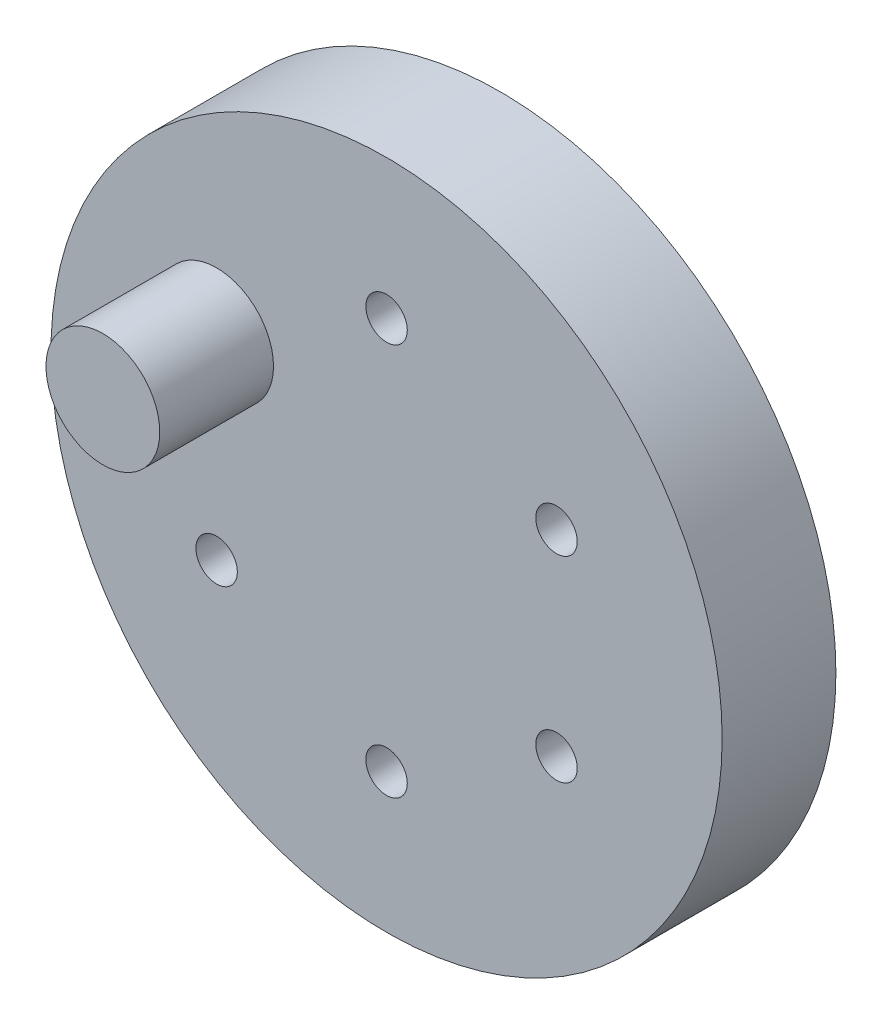
ISO-10303-21;
HEADER;
FILE_DESCRIPTION(('STEP AP214'),'2;1');
FILE_NAME('part.step','',(''),(''),'','','');
FILE_SCHEMA(('AUTOMOTIVE_DESIGN { 1 0 10303 214 1 1 1 1 }'));
ENDSEC;
DATA;
#1=APPLICATION_CONTEXT('core data for automotive mechanical design processes');
#2=APPLICATION_PROTOCOL_DEFINITION('international standard','automotive_design',2000,#1);
#3=PRODUCT_CONTEXT('',#1,'mechanical');
#4=PRODUCT('Part','Part','',(#3));
#5=PRODUCT_RELATED_PRODUCT_CATEGORY('part','',(#4));
#6=PRODUCT_DEFINITION_FORMATION('','',#4);
#7=PRODUCT_DEFINITION_CONTEXT('part definition',#1,'design');
#8=PRODUCT_DEFINITION('design','',#6,#7);
#9=PRODUCT_DEFINITION_SHAPE('','',#8);
#10=(LENGTH_UNIT() NAMED_UNIT(*) SI_UNIT(.MILLI.,.METRE.));
#11=(NAMED_UNIT(*) PLANE_ANGLE_UNIT() SI_UNIT($,.RADIAN.));
#12=(NAMED_UNIT(*) SI_UNIT($,.STERADIAN.) SOLID_ANGLE_UNIT());
#13=UNCERTAINTY_MEASURE_WITH_UNIT(LENGTH_MEASURE(1.E-05),#10,'distance_accuracy_value','');
#14=(GEOMETRIC_REPRESENTATION_CONTEXT(3) GLOBAL_UNCERTAINTY_ASSIGNED_CONTEXT((#13)) GLOBAL_UNIT_ASSIGNED_CONTEXT((#10,
#11,#12)) REPRESENTATION_CONTEXT('',''));
#15=CARTESIAN_POINT('',(0.,0.,0.));
#16=DIRECTION('',(0.,0.,1.));
#17=DIRECTION('',(1.,0.,0.));
#18=AXIS2_PLACEMENT_3D('',#15,#16,#17);
#19=CARTESIAN_POINT('',(0.,0.,10.));
#20=DIRECTION('',(0.,0.,1.));
#21=DIRECTION('',(1.,0.,0.));
#22=AXIS2_PLACEMENT_3D('',#19,#20,#21);
#23=PLANE('',#22);
#24=CARTESIAN_POINT('',(-14.9389382152815,8.62500000000017,10.));
#25=DIRECTION('',(0.,0.,1.));
#26=DIRECTION('',(1.,0.,0.));
#27=AXIS2_PLACEMENT_3D('',#24,#25,#26);
#28=CIRCLE('',#27,5.);
#29=CARTESIAN_POINT('',(-9.93893821528146,8.62500000000017,10.));
#30=VERTEX_POINT('',#29);
#31=EDGE_CURVE('E86',#30,#30,#28,.T.);
#32=ORIENTED_EDGE('',*,*,#31,.F.);
#33=EDGE_LOOP('',(#32));
#34=FACE_BOUND('',#33,.T.);
#35=CARTESIAN_POINT('',(-14.9389382152816,-8.62499999999986,10.));
#36=DIRECTION('',(0.,0.,1.));
#37=DIRECTION('',(1.,0.,0.));
#38=AXIS2_PLACEMENT_3D('',#35,#36,#37);
#39=CIRCLE('',#38,1.82136949029676);
#40=CARTESIAN_POINT('',(-13.1175687249849,-8.62499999999986,10.));
#41=VERTEX_POINT('',#40);
#42=EDGE_CURVE('E71',#41,#41,#39,.T.);
#43=ORIENTED_EDGE('',*,*,#42,.F.);
#44=EDGE_LOOP('',(#43));
#45=FACE_BOUND('',#44,.T.);
#46=CARTESIAN_POINT('',(14.9389382152815,-8.62500000000007,10.));
#47=DIRECTION('',(0.,0.,1.));
#48=DIRECTION('',(1.,0.,0.));
#49=AXIS2_PLACEMENT_3D('',#46,#47,#48);
#50=CIRCLE('',#49,1.82136949029675);
#51=CARTESIAN_POINT('',(16.7603077055783,-8.62500000000007,10.));
#52=VERTEX_POINT('',#51);
#53=EDGE_CURVE('E59',#52,#52,#50,.T.);
#54=ORIENTED_EDGE('',*,*,#53,.F.);
#55=EDGE_LOOP('',(#54));
#56=FACE_BOUND('',#55,.T.);
#57=CARTESIAN_POINT('',(0.,17.25,10.));
#58=DIRECTION('',(0.,0.,1.));
#59=DIRECTION('',(1.,0.,0.));
#60=AXIS2_PLACEMENT_3D('',#57,#58,#59);
#61=CIRCLE('',#60,1.82136949029675);
#62=CARTESIAN_POINT('',(1.82136949029675,17.25,10.));
#63=VERTEX_POINT('',#62);
#64=EDGE_CURVE('E48',#63,#63,#61,.T.);
#65=ORIENTED_EDGE('',*,*,#64,.F.);
#66=EDGE_LOOP('',(#65));
#67=FACE_BOUND('',#66,.T.);
#68=CARTESIAN_POINT('',(0.,0.,10.));
#69=DIRECTION('',(0.,0.,1.));
#70=DIRECTION('',(1.,0.,0.));
#71=AXIS2_PLACEMENT_3D('',#68,#69,#70);
#72=CIRCLE('',#71,29.5);
#73=CARTESIAN_POINT('',(29.5,0.,10.));
#74=VERTEX_POINT('',#73);
#75=EDGE_CURVE('E10',#74,#74,#72,.T.);
#76=ORIENTED_EDGE('',*,*,#75,.T.);
#77=EDGE_LOOP('',(#76));
#78=FACE_BOUND('',#77,.T.);
#79=CARTESIAN_POINT('',(14.9389382152816,8.62499999999997,10.));
#80=DIRECTION('',(0.,0.,1.));
#81=DIRECTION('',(1.,0.,0.));
#82=AXIS2_PLACEMENT_3D('',#79,#80,#81);
#83=CIRCLE('',#82,1.82136949029675);
#84=CARTESIAN_POINT('',(16.7603077055783,8.62499999999997,10.));
#85=VERTEX_POINT('',#84);
#86=EDGE_CURVE('E53',#85,#85,#83,.T.);
#87=ORIENTED_EDGE('',*,*,#86,.F.);
#88=EDGE_LOOP('',(#87));
#89=FACE_BOUND('',#88,.T.);
#90=CARTESIAN_POINT('',(-1.20456106190088E-13,-17.25,10.));
#91=DIRECTION('',(0.,0.,1.));
#92=DIRECTION('',(1.,0.,0.));
#93=AXIS2_PLACEMENT_3D('',#90,#91,#92);
#94=CIRCLE('',#93,1.82136949029675);
#95=CARTESIAN_POINT('',(1.82136949029663,-17.25,10.));
#96=VERTEX_POINT('',#95);
#97=EDGE_CURVE('E65',#96,#96,#94,.T.);
#98=ORIENTED_EDGE('',*,*,#97,.F.);
#99=EDGE_LOOP('',(#98));
#100=FACE_BOUND('',#99,.T.);
#101=ADVANCED_FACE('F37',(#34,#45,#56,#67,#78,#89,#100),#23,.T.);
#102=CARTESIAN_POINT('',(0.,0.,0.));
#103=DIRECTION('',(0.,0.,1.));
#104=DIRECTION('',(1.,0.,0.));
#105=AXIS2_PLACEMENT_3D('',#102,#103,#104);
#106=PLANE('',#105);
#107=CARTESIAN_POINT('',(0.,0.,0.));
#108=DIRECTION('',(0.,0.,1.));
#109=DIRECTION('',(1.,0.,0.));
#110=AXIS2_PLACEMENT_3D('',#107,#108,#109);
#111=CIRCLE('',#110,29.5);
#112=CARTESIAN_POINT('',(29.5,0.,0.));
#113=VERTEX_POINT('',#112);
#114=EDGE_CURVE('E41',#113,#113,#111,.T.);
#115=ORIENTED_EDGE('',*,*,#114,.F.);
#116=EDGE_LOOP('',(#115));
#117=FACE_BOUND('',#116,.T.);
#118=CARTESIAN_POINT('',(0.,17.25,0.));
#119=DIRECTION('',(0.,0.,1.));
#120=DIRECTION('',(1.,0.,0.));
#121=AXIS2_PLACEMENT_3D('',#118,#119,#120);
#122=CIRCLE('',#121,1.82136949029675);
#123=CARTESIAN_POINT('',(1.82136949029675,17.25,0.));
#124=VERTEX_POINT('',#123);
#125=EDGE_CURVE('E50',#124,#124,#122,.T.);
#126=ORIENTED_EDGE('',*,*,#125,.T.);
#127=EDGE_LOOP('',(#126));
#128=FACE_BOUND('',#127,.T.);
#129=CARTESIAN_POINT('',(14.9389382152816,8.62499999999997,0.));
#130=DIRECTION('',(0.,0.,1.));
#131=DIRECTION('',(1.,0.,0.));
#132=AXIS2_PLACEMENT_3D('',#129,#130,#131);
#133=CIRCLE('',#132,1.82136949029675);
#134=CARTESIAN_POINT('',(16.7603077055783,8.62499999999997,0.));
#135=VERTEX_POINT('',#134);
#136=EDGE_CURVE('E56',#135,#135,#133,.T.);
#137=ORIENTED_EDGE('',*,*,#136,.T.);
#138=EDGE_LOOP('',(#137));
#139=FACE_BOUND('',#138,.T.);
#140=CARTESIAN_POINT('',(14.9389382152815,-8.62500000000007,0.));
#141=DIRECTION('',(0.,0.,1.));
#142=DIRECTION('',(1.,0.,0.));
#143=AXIS2_PLACEMENT_3D('',#140,#141,#142);
#144=CIRCLE('',#143,1.82136949029675);
#145=CARTESIAN_POINT('',(16.7603077055783,-8.62500000000007,0.));
#146=VERTEX_POINT('',#145);
#147=EDGE_CURVE('E62',#146,#146,#144,.T.);
#148=ORIENTED_EDGE('',*,*,#147,.T.);
#149=EDGE_LOOP('',(#148));
#150=FACE_BOUND('',#149,.T.);
#151=CARTESIAN_POINT('',(-1.20456106190088E-13,-17.25,0.));
#152=DIRECTION('',(0.,0.,1.));
#153=DIRECTION('',(1.,0.,0.));
#154=AXIS2_PLACEMENT_3D('',#151,#152,#153);
#155=CIRCLE('',#154,1.82136949029675);
#156=CARTESIAN_POINT('',(1.82136949029663,-17.25,0.));
#157=VERTEX_POINT('',#156);
#158=EDGE_CURVE('E68',#157,#157,#155,.T.);
#159=ORIENTED_EDGE('',*,*,#158,.T.);
#160=EDGE_LOOP('',(#159));
#161=FACE_BOUND('',#160,.T.);
#162=CARTESIAN_POINT('',(-14.9389382152816,-8.62499999999986,0.));
#163=DIRECTION('',(0.,0.,1.));
#164=DIRECTION('',(1.,0.,0.));
#165=AXIS2_PLACEMENT_3D('',#162,#163,#164);
#166=CIRCLE('',#165,1.82136949029676);
#167=CARTESIAN_POINT('',(-13.1175687249849,-8.62499999999986,0.));
#168=VERTEX_POINT('',#167);
#169=EDGE_CURVE('E74',#168,#168,#166,.T.);
#170=ORIENTED_EDGE('',*,*,#169,.T.);
#171=EDGE_LOOP('',(#170));
#172=FACE_BOUND('',#171,.T.);
#173=CARTESIAN_POINT('',(-14.9389382152815,8.62500000000017,0.));
#174=DIRECTION('',(0.,0.,1.));
#175=DIRECTION('',(1.,0.,0.));
#176=AXIS2_PLACEMENT_3D('',#173,#174,#175);
#177=CIRCLE('',#176,1.82136949029676);
#178=CARTESIAN_POINT('',(-13.1175687249847,8.62500000000017,0.));
#179=VERTEX_POINT('',#178);
#180=EDGE_CURVE('E77',#179,#179,#177,.T.);
#181=ORIENTED_EDGE('',*,*,#180,.T.);
#182=EDGE_LOOP('',(#181));
#183=FACE_BOUND('',#182,.T.);
#184=ADVANCED_FACE('F103',(#117,#128,#139,#150,#161,#172,#183),#106,.F.);
#185=CARTESIAN_POINT('',(0.,0.,10.));
#186=DIRECTION('',(0.,0.,-1.));
#187=DIRECTION('',(-1.,0.,0.));
#188=AXIS2_PLACEMENT_3D('',#185,#186,#187);
#189=CYLINDRICAL_SURFACE('',#188,29.5);
#190=ORIENTED_EDGE('',*,*,#75,.F.);
#191=EDGE_LOOP('',(#190));
#192=FACE_BOUND('',#191,.T.);
#193=ORIENTED_EDGE('',*,*,#114,.T.);
#194=EDGE_LOOP('',(#193));
#195=FACE_BOUND('',#194,.T.);
#196=ADVANCED_FACE('F39',(#192,#195),#189,.T.);
#197=CARTESIAN_POINT('',(0.,17.25,10.));
#198=DIRECTION('',(0.,0.,-1.));
#199=DIRECTION('',(-1.,0.,0.));
#200=AXIS2_PLACEMENT_3D('',#197,#198,#199);
#201=CYLINDRICAL_SURFACE('',#200,1.82136949029675);
#202=ORIENTED_EDGE('',*,*,#64,.T.);
#203=EDGE_LOOP('',(#202));
#204=FACE_BOUND('',#203,.T.);
#205=ORIENTED_EDGE('',*,*,#125,.F.);
#206=EDGE_LOOP('',(#205));
#207=FACE_BOUND('',#206,.T.);
#208=ADVANCED_FACE('F149',(#204,#207),#201,.F.);
#209=CARTESIAN_POINT('',(14.9389382152816,8.62499999999997,10.));
#210=DIRECTION('',(0.,0.,-1.));
#211=DIRECTION('',(-1.,0.,0.));
#212=AXIS2_PLACEMENT_3D('',#209,#210,#211);
#213=CYLINDRICAL_SURFACE('',#212,1.82136949029675);
#214=ORIENTED_EDGE('',*,*,#86,.T.);
#215=EDGE_LOOP('',(#214));
#216=FACE_BOUND('',#215,.T.);
#217=ORIENTED_EDGE('',*,*,#136,.F.);
#218=EDGE_LOOP('',(#217));
#219=FACE_BOUND('',#218,.T.);
#220=ADVANCED_FACE('F145',(#216,#219),#213,.F.);
#221=CARTESIAN_POINT('',(14.9389382152815,-8.62500000000007,10.));
#222=DIRECTION('',(0.,0.,-1.));
#223=DIRECTION('',(-1.,0.,0.));
#224=AXIS2_PLACEMENT_3D('',#221,#222,#223);
#225=CYLINDRICAL_SURFACE('',#224,1.82136949029675);
#226=ORIENTED_EDGE('',*,*,#53,.T.);
#227=EDGE_LOOP('',(#226));
#228=FACE_BOUND('',#227,.T.);
#229=ORIENTED_EDGE('',*,*,#147,.F.);
#230=EDGE_LOOP('',(#229));
#231=FACE_BOUND('',#230,.T.);
#232=ADVANCED_FACE('F119',(#228,#231),#225,.F.);
#233=CARTESIAN_POINT('',(-1.20456106190088E-13,-17.25,10.));
#234=DIRECTION('',(0.,0.,-1.));
#235=DIRECTION('',(-1.,0.,0.));
#236=AXIS2_PLACEMENT_3D('',#233,#234,#235);
#237=CYLINDRICAL_SURFACE('',#236,1.82136949029675);
#238=ORIENTED_EDGE('',*,*,#97,.T.);
#239=EDGE_LOOP('',(#238));
#240=FACE_BOUND('',#239,.T.);
#241=ORIENTED_EDGE('',*,*,#158,.F.);
#242=EDGE_LOOP('',(#241));
#243=FACE_BOUND('',#242,.T.);
#244=ADVANCED_FACE('F115',(#240,#243),#237,.F.);
#245=CARTESIAN_POINT('',(-14.9389382152816,-8.62499999999986,10.));
#246=DIRECTION('',(0.,0.,-1.));
#247=DIRECTION('',(-1.,0.,0.));
#248=AXIS2_PLACEMENT_3D('',#245,#246,#247);
#249=CYLINDRICAL_SURFACE('',#248,1.82136949029676);
#250=ORIENTED_EDGE('',*,*,#42,.T.);
#251=EDGE_LOOP('',(#250));
#252=FACE_BOUND('',#251,.T.);
#253=ORIENTED_EDGE('',*,*,#169,.F.);
#254=EDGE_LOOP('',(#253));
#255=FACE_BOUND('',#254,.T.);
#256=ADVANCED_FACE('F118',(#252,#255),#249,.F.);
#257=CARTESIAN_POINT('',(-14.9389382152815,8.62500000000017,10.));
#258=DIRECTION('',(0.,0.,-1.));
#259=DIRECTION('',(-1.,0.,0.));
#260=AXIS2_PLACEMENT_3D('',#257,#258,#259);
#261=CYLINDRICAL_SURFACE('',#260,1.82136949029676);
#262=CARTESIAN_POINT('',(-14.9389382152815,8.62500000000017,10.));
#263=DIRECTION('',(0.,0.,1.));
#264=DIRECTION('',(1.,0.,0.));
#265=AXIS2_PLACEMENT_3D('',#262,#263,#264);
#266=CIRCLE('',#265,1.82136949029676);
#267=CARTESIAN_POINT('',(-13.1175687249847,8.62500000000017,10.));
#268=VERTEX_POINT('',#267);
#269=EDGE_CURVE('E82',#268,#268,#266,.T.);
#270=ORIENTED_EDGE('',*,*,#269,.T.);
#271=EDGE_LOOP('',(#270));
#272=FACE_BOUND('',#271,.T.);
#273=ORIENTED_EDGE('',*,*,#180,.F.);
#274=EDGE_LOOP('',(#273));
#275=FACE_BOUND('',#274,.T.);
#276=ADVANCED_FACE('F130',(#272,#275),#261,.F.);
#277=CARTESIAN_POINT('',(-14.9389382152815,8.62500000000017,10.));
#278=DIRECTION('',(0.,0.,1.));
#279=DIRECTION('',(1.,0.,0.));
#280=AXIS2_PLACEMENT_3D('',#277,#278,#279);
#281=PLANE('',#280);
#282=ORIENTED_EDGE('',*,*,#269,.F.);
#283=EDGE_LOOP('',(#282));
#284=FACE_BOUND('',#283,.T.);
#285=ADVANCED_FACE('F97',(#284),#281,.F.);
#286=CARTESIAN_POINT('',(-14.9389382152815,8.62500000000017,20.));
#287=DIRECTION('',(0.,0.,-1.));
#288=DIRECTION('',(-1.,0.,0.));
#289=AXIS2_PLACEMENT_3D('',#286,#287,#288);
#290=CYLINDRICAL_SURFACE('',#289,5.);
#291=CARTESIAN_POINT('',(-14.9389382152815,8.62500000000017,20.));
#292=DIRECTION('',(0.,0.,1.));
#293=DIRECTION('',(1.,0.,0.));
#294=AXIS2_PLACEMENT_3D('',#291,#292,#293);
#295=CIRCLE('',#294,5.);
#296=CARTESIAN_POINT('',(-9.93893821528146,8.62500000000017,20.));
#297=VERTEX_POINT('',#296);
#298=EDGE_CURVE('E85',#297,#297,#295,.T.);
#299=ORIENTED_EDGE('',*,*,#298,.F.);
#300=EDGE_LOOP('',(#299));
#301=FACE_BOUND('',#300,.T.);
#302=ORIENTED_EDGE('',*,*,#31,.T.);
#303=EDGE_LOOP('',(#302));
#304=FACE_BOUND('',#303,.T.);
#305=ADVANCED_FACE('F94',(#301,#304),#290,.T.);
#306=CARTESIAN_POINT('',(-14.9389382152815,8.62500000000017,20.));
#307=DIRECTION('',(0.,0.,1.));
#308=DIRECTION('',(1.,0.,0.));
#309=AXIS2_PLACEMENT_3D('',#306,#307,#308);
#310=PLANE('',#309);
#311=ORIENTED_EDGE('',*,*,#298,.T.);
#312=EDGE_LOOP('',(#311));
#313=FACE_BOUND('',#312,.T.);
#314=ADVANCED_FACE('F92',(#313),#310,.T.);
#315=CLOSED_SHELL('',(#101,#184,#196,#208,#220,#232,#244,#256,#276,#285,#305,#314));
#316=MANIFOLD_SOLID_BREP('B2',#315);
#317=ADVANCED_BREP_SHAPE_REPRESENTATION('',(#18,#316),#14);
#318=SHAPE_DEFINITION_REPRESENTATION(#9,#317);
ENDSEC;
END-ISO-10303-21;
